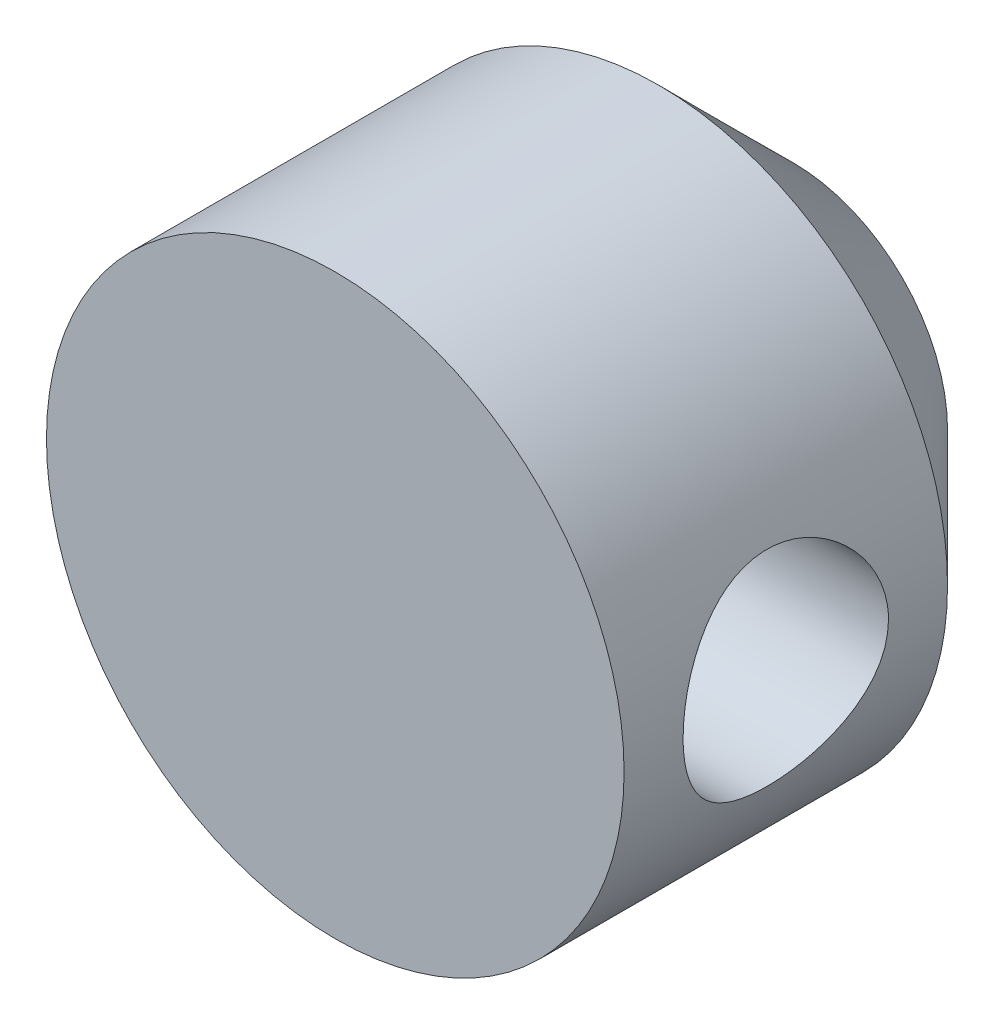
ISO-10303-21;
HEADER;
FILE_DESCRIPTION(('STEP AP214'),'2;1');
FILE_NAME('part.step','',(''),(''),'','','');
FILE_SCHEMA(('AUTOMOTIVE_DESIGN { 1 0 10303 214 1 1 1 1 }'));
ENDSEC;
DATA;
#1=APPLICATION_CONTEXT('core data for automotive mechanical design processes');
#2=APPLICATION_PROTOCOL_DEFINITION('international standard','automotive_design',2000,#1);
#3=PRODUCT_CONTEXT('',#1,'mechanical');
#4=PRODUCT('Part','Part','',(#3));
#5=PRODUCT_RELATED_PRODUCT_CATEGORY('part','',(#4));
#6=PRODUCT_DEFINITION_FORMATION('','',#4);
#7=PRODUCT_DEFINITION_CONTEXT('part definition',#1,'design');
#8=PRODUCT_DEFINITION('design','',#6,#7);
#9=PRODUCT_DEFINITION_SHAPE('','',#8);
#10=(LENGTH_UNIT() NAMED_UNIT(*) SI_UNIT(.MILLI.,.METRE.));
#11=(NAMED_UNIT(*) PLANE_ANGLE_UNIT() SI_UNIT($,.RADIAN.));
#12=(NAMED_UNIT(*) SI_UNIT($,.STERADIAN.) SOLID_ANGLE_UNIT());
#13=UNCERTAINTY_MEASURE_WITH_UNIT(LENGTH_MEASURE(1.E-05),#10,'distance_accuracy_value','');
#14=(GEOMETRIC_REPRESENTATION_CONTEXT(3) GLOBAL_UNCERTAINTY_ASSIGNED_CONTEXT((#13)) GLOBAL_UNIT_ASSIGNED_CONTEXT((#10,
#11,#12)) REPRESENTATION_CONTEXT('',''));
#15=CARTESIAN_POINT('',(0.,0.,0.));
#16=DIRECTION('',(0.,0.,1.));
#17=DIRECTION('',(1.,0.,0.));
#18=AXIS2_PLACEMENT_3D('',#15,#16,#17);
#19=CARTESIAN_POINT('',(-2.22044604925031E-13,0.,0.));
#20=DIRECTION('',(0.,0.,1.));
#21=DIRECTION('',(1.,0.,0.));
#22=AXIS2_PLACEMENT_3D('',#19,#20,#21);
#23=CONICAL_SURFACE('',#22,28.575,0.78539816339745);
#24=CARTESIAN_POINT('',(-6.66133814775094E-13,0.,25.0000000000008));
#25=DIRECTION('',(0.,0.,1.));
#26=DIRECTION('',(1.,0.,0.));
#27=AXIS2_PLACEMENT_3D('',#24,#25,#26);
#28=CIRCLE('',#27,53.5750000000001);
#29=CARTESIAN_POINT('',(53.5749999999994,0.,25.0000000000008));
#30=VERTEX_POINT('',#29);
#31=EDGE_CURVE('E48',#30,#30,#28,.T.);
#32=ORIENTED_EDGE('',*,*,#31,.F.);
#33=EDGE_LOOP('',(#32));
#34=FACE_BOUND('',#33,.T.);
#35=CARTESIAN_POINT('',(-2.22044604925031E-13,0.,0.));
#36=DIRECTION('',(0.,0.,1.));
#37=DIRECTION('',(1.,0.,0.));
#38=AXIS2_PLACEMENT_3D('',#35,#36,#37);
#39=CIRCLE('',#38,28.575);
#40=CARTESIAN_POINT('',(28.5749999999998,0.,0.));
#41=VERTEX_POINT('',#40);
#42=EDGE_CURVE('E52',#41,#41,#39,.T.);
#43=ORIENTED_EDGE('',*,*,#42,.T.);
#44=EDGE_LOOP('',(#43));
#45=FACE_BOUND('',#44,.T.);
#46=ADVANCED_FACE('F34',(#34,#45),#23,.T.);
#47=CARTESIAN_POINT('',(-2.22044604925031E-13,0.,0.));
#48=DIRECTION('',(0.,0.,1.));
#49=DIRECTION('',(1.,0.,0.));
#50=AXIS2_PLACEMENT_3D('',#47,#48,#49);
#51=PLANE('',#50);
#52=ORIENTED_EDGE('',*,*,#42,.F.);
#53=EDGE_LOOP('',(#52));
#54=FACE_BOUND('',#53,.T.);
#55=ADVANCED_FACE('F71',(#54),#51,.F.);
#56=CARTESIAN_POINT('',(-6.66133814775094E-13,-6.66133814775094E-13,85.0000000000009));
#57=DIRECTION('',(0.,0.,-1.));
#58=DIRECTION('',(-1.,0.,0.));
#59=AXIS2_PLACEMENT_3D('',#56,#57,#58);
#60=CYLINDRICAL_SURFACE('',#59,53.5750000000001);
#61=CARTESIAN_POINT('',(-53.5750000000007,0.,35.9500000000001));
#62=CARTESIAN_POINT('',(-53.5750009042957,0.517683286684535,35.9499987245617));
#63=CARTESIAN_POINT('',(-53.5674799680966,1.0353479734931,35.9711185306932));
#64=CARTESIAN_POINT('',(-53.537604948691,2.06679402374458,36.055381301015));
#65=CARTESIAN_POINT('',(-53.5152515736517,2.5805755714016,36.1185222589272));
#66=CARTESIAN_POINT('',(-53.4563200288301,3.60047360863516,36.2862036891231));
#67=CARTESIAN_POINT('',(-53.4197424809623,4.10659043232655,36.390742351405));
#68=CARTESIAN_POINT('',(-53.333342459477,5.10760273371078,36.6402348822385));
#69=CARTESIAN_POINT('',(-53.2835197601504,5.60249802002261,36.7851894395153));
#70=CARTESIAN_POINT('',(-53.1720448167393,6.57679881218548,37.1139140406836));
#71=CARTESIAN_POINT('',(-53.1104147278737,7.05623139405239,37.2976114521261));
#72=CARTESIAN_POINT('',(-52.9768491830529,7.99750355425714,37.7024590607166));
#73=CARTESIAN_POINT('',(-52.904913782489,8.45934322714033,37.9236090565573));
#74=CARTESIAN_POINT('',(-52.7525341629502,9.36272718575201,38.4017149060764));
#75=CARTESIAN_POINT('',(-52.672088408913,9.80426778934299,38.6586772220951));
#76=CARTESIAN_POINT('',(-52.50468913618,10.6644391857606,39.2065746885147));
#77=CARTESIAN_POINT('',(-52.4177354343655,11.0830693333654,39.4975107949892));
#78=CARTESIAN_POINT('',(-52.2363314122028,11.9092990576828,40.1222108672873));
#79=CARTESIAN_POINT('',(-52.1417252950923,12.3160016414434,40.4571163527665));
#80=CARTESIAN_POINT('',(-51.9502954189071,13.1000114935635,41.1591510469942));
#81=CARTESIAN_POINT('',(-51.8534716140418,13.4773181542483,41.5262809215542));
#82=CARTESIAN_POINT('',(-51.6601320045238,14.2004051253775,42.2906399227101));
#83=CARTESIAN_POINT('',(-51.5636162854273,14.5461773081958,42.6878767609737));
#84=CARTESIAN_POINT('',(-51.37350909741,15.2039608081279,43.5100375728573));
#85=CARTESIAN_POINT('',(-51.2799176169988,15.5159722579126,43.934961437664));
#86=CARTESIAN_POINT('',(-51.0951863348062,16.1140878150535,44.8247557936476));
#87=CARTESIAN_POINT('',(-51.0042346538654,16.3989687400299,45.2904888780667));
#88=CARTESIAN_POINT('',(-50.8310010428056,16.9283064352598,46.2459597465815));
#89=CARTESIAN_POINT('',(-50.7487193557879,17.1727620721232,46.7356982032086));
#90=CARTESIAN_POINT('',(-50.5954859865528,17.619112604437,47.7357649525373));
#91=CARTESIAN_POINT('',(-50.5245311759774,17.8210192563954,48.2460875111908));
#92=CARTESIAN_POINT('',(-50.3963102292922,18.1804566864659,49.2837990193872));
#93=CARTESIAN_POINT('',(-50.3390433810658,18.33798977319,49.8111870794755));
#94=CARTESIAN_POINT('',(-50.2420618824237,18.6020128280836,50.8589342840411));
#95=CARTESIAN_POINT('',(-50.2017684073201,18.7101987816225,51.378812549969));
#96=CARTESIAN_POINT('',(-50.1370746734433,18.882873309271,52.4267600535403));
#97=CARTESIAN_POINT('',(-50.1126740435773,18.9473629036775,52.9548290996368));
#98=CARTESIAN_POINT('',(-50.0806157470271,19.0319364701942,54.0148542346612));
#99=CARTESIAN_POINT('',(-50.072952863072,19.052034279552,54.5468090604755));
#100=CARTESIAN_POINT('',(-50.0746244700264,19.0476409730848,55.6104984257232));
#101=CARTESIAN_POINT('',(-50.0839583913898,19.0231513513401,56.1422329719408));
#102=CARTESIAN_POINT('',(-50.1183536748408,18.9323379780826,57.1731281171759));
#103=CARTESIAN_POINT('',(-50.1425549136263,18.8683011569153,57.6725209947976));
#104=CARTESIAN_POINT('',(-50.2051472007502,18.7011169963627,58.6637886271437));
#105=CARTESIAN_POINT('',(-50.2435376727001,18.5979712456382,59.1556636864084));
#106=CARTESIAN_POINT('',(-50.3333531690773,18.3535040780302,60.1286495035839));
#107=CARTESIAN_POINT('',(-50.3847794216127,18.2121790641743,60.6097592426377));
#108=CARTESIAN_POINT('',(-50.4991634196981,17.8925654550268,61.5581256682425));
#109=CARTESIAN_POINT('',(-50.5621215083783,17.7142757598292,62.0253819421024));
#110=CARTESIAN_POINT('',(-50.6989976430138,17.3186838728386,62.9513272014527));
#111=CARTESIAN_POINT('',(-50.7730891271025,17.1007501204542,63.4097205372311));
#112=CARTESIAN_POINT('',(-50.9293219492453,16.6296824480774,64.3065973290737));
#113=CARTESIAN_POINT('',(-51.0114633271021,16.3765483540344,64.7450806866774));
#114=CARTESIAN_POINT('',(-51.1816276780509,15.836719888503,65.5998289752987));
#115=CARTESIAN_POINT('',(-51.2696521789896,15.5500167844959,66.0160880837961));
#116=CARTESIAN_POINT('',(-51.4493045125963,14.9448751846309,66.8240424717227));
#117=CARTESIAN_POINT('',(-51.5409324909665,14.6264354047391,67.2157367562384));
#118=CARTESIAN_POINT('',(-51.7310486013983,13.9396432059813,67.9951748808241));
#119=CARTESIAN_POINT('',(-51.8296185348351,13.5694425616828,68.3812722464586));
#120=CARTESIAN_POINT('',(-52.0255462679493,12.7977196630611,69.12114139699));
#121=CARTESIAN_POINT('',(-52.122904020069,12.3961961843097,69.4749119170362));
#122=CARTESIAN_POINT('',(-52.3137860486001,11.5641933679632,70.1478788446041));
#123=CARTESIAN_POINT('',(-52.4073098105853,11.1337101650238,70.4670706218928));
#124=CARTESIAN_POINT('',(-52.587981568426,10.2464509250506,71.0686030154755));
#125=CARTESIAN_POINT('',(-52.6751296079017,9.78967506793845,71.3509438838985));
#126=CARTESIAN_POINT('',(-52.8417286684245,8.84671822187346,71.8799888636882));
#127=CARTESIAN_POINT('',(-52.921067691352,8.36023712025865,72.1261940293476));
#128=CARTESIAN_POINT('',(-53.068516205567,7.36651096565864,72.5765348927666));
#129=CARTESIAN_POINT('',(-53.1366255219585,6.85926558943555,72.7806699353209));
#130=CARTESIAN_POINT('',(-53.2596167386403,5.82781970539629,73.1449179763384));
#131=CARTESIAN_POINT('',(-53.3145028974742,5.30362471808572,73.3050451499658));
#132=CARTESIAN_POINT('',(-53.4094455974232,4.24212395174735,73.5797577143168));
#133=CARTESIAN_POINT('',(-53.4495029264223,3.70481887090119,73.6943455246576));
#134=CARTESIAN_POINT('',(-53.5120254928523,2.64771035443423,73.8723429271238));
#135=CARTESIAN_POINT('',(-53.5352504854556,2.12832389537014,73.937967355563));
#136=CARTESIAN_POINT('',(-53.5665426002022,1.08546169798756,74.0262471386376));
#137=CARTESIAN_POINT('',(-53.5746102134453,0.561986092709421,74.0489038854279));
#138=CARTESIAN_POINT('',(-53.5753621078564,-0.484969548404686,74.0510182727164));
#139=CARTESIAN_POINT('',(-53.5680490524678,-1.00844956777848,74.0304833926325));
#140=CARTESIAN_POINT('',(-53.5382494052639,-2.0515064260186,73.9464394594926));
#141=CARTESIAN_POINT('',(-53.5157630050344,-2.5710833140839,73.8829309490413));
#142=CARTESIAN_POINT('',(-53.4572525956026,-3.58494910532398,73.7164517065943));
#143=CARTESIAN_POINT('',(-53.4217129462269,-4.07949843624773,73.6148905466835));
#144=CARTESIAN_POINT('',(-53.3379678520519,-5.05795503011836,73.3731743411988));
#145=CARTESIAN_POINT('',(-53.2897627694143,-5.54186259693233,73.2330203991604));
#146=CARTESIAN_POINT('',(-53.1818931603168,-6.49595214268832,72.9152992894683));
#147=CARTESIAN_POINT('',(-53.122227660261,-6.96613295159006,72.7377289430576));
#148=CARTESIAN_POINT('',(-52.9929089947445,-7.88985145512553,72.3465941558526));
#149=CARTESIAN_POINT('',(-52.9232555232998,-8.34338863934304,72.1330286123016));
#150=CARTESIAN_POINT('',(-52.7735700224386,-9.24364435602619,71.6649959991927));
#151=CARTESIAN_POINT('',(-52.6933015334285,-9.68981405995557,71.4095490295748));
#152=CARTESIAN_POINT('',(-52.5260000832169,-10.5591628847586,70.8641079168116));
#153=CARTESIAN_POINT('',(-52.4389670298326,-10.9823416921951,70.5741133028467));
#154=CARTESIAN_POINT('',(-52.2602689802372,-11.8034538603555,69.9613991550422));
#155=CARTESIAN_POINT('',(-52.1686026459479,-12.2013798524367,69.6386701401996));
#156=CARTESIAN_POINT('',(-51.9829262090086,-12.9696657593257,68.9625267370625));
#157=CARTESIAN_POINT('',(-51.8889160326753,-13.3400248060505,68.609111383214));
#158=CARTESIAN_POINT('',(-51.6959920055591,-14.069639448986,67.8544676031126));
#159=CARTESIAN_POINT('',(-51.5970776881153,-14.4273129501072,67.4517078065438));
#160=CARTESIAN_POINT('',(-51.4020102048315,-15.1075883232304,66.6169358356553));
#161=CARTESIAN_POINT('',(-51.3058571412624,-15.4301888974361,66.1849225798351));
#162=CARTESIAN_POINT('',(-51.1190761289569,-16.0381371558674,65.2942407046809));
#163=CARTESIAN_POINT('',(-51.0284485864972,-16.3234821025435,64.8355701301374));
#164=CARTESIAN_POINT('',(-50.855438086889,-16.8547658368213,63.8944555952746));
#165=CARTESIAN_POINT('',(-50.773054992354,-17.1007052811229,63.4120120313117));
#166=CARTESIAN_POINT('',(-50.6190365376997,-17.5513693362448,62.4260347205875));
#167=CARTESIAN_POINT('',(-50.5474108982023,-17.7560567274103,61.9224824188337));
#168=CARTESIAN_POINT('',(-50.4173448351656,-18.1220786716304,60.8981806017724));
#169=CARTESIAN_POINT('',(-50.358904490694,-18.2834129647119,60.3774309833599));
#170=CARTESIAN_POINT('',(-50.2572365792569,-18.5610527820157,59.3228444719039));
#171=CARTESIAN_POINT('',(-50.2140021977121,-18.6773784792663,58.7890135562966));
#172=CARTESIAN_POINT('',(-50.144252316857,-18.8638422098205,57.7122747144352));
#173=CARTESIAN_POINT('',(-50.1177358121698,-18.9339830205944,57.169367336036));
#174=CARTESIAN_POINT('',(-50.0834145686287,-19.024573006956,56.110729379965));
#175=CARTESIAN_POINT('',(-50.0746103310436,-19.0476774272699,55.5952567427427));
#176=CARTESIAN_POINT('',(-50.0729702771832,-19.0519892160963,54.5641222599813));
#177=CARTESIAN_POINT('',(-50.0801338123746,-19.0331982861942,54.0484604229771));
#178=CARTESIAN_POINT('',(-50.1101918777172,-18.9539197686993,53.0208635658067));
#179=CARTESIAN_POINT('',(-50.1330852059748,-18.8934353668507,52.5089282639208));
#180=CARTESIAN_POINT('',(-50.1938564607551,-18.7313872350656,51.4925115609706));
#181=CARTESIAN_POINT('',(-50.2317344092067,-18.6298234450124,50.9880301708157));
#182=CARTESIAN_POINT('',(-50.3201625536368,-18.3896110412238,50.0024398707026));
#183=CARTESIAN_POINT('',(-50.3703763680109,-18.2519411619074,49.5210614682616));
#184=CARTESIAN_POINT('',(-50.4824419374438,-17.9396537166585,48.5718624781645));
#185=CARTESIAN_POINT('',(-50.5442934229803,-17.7650370063832,48.1040415768135));
#186=CARTESIAN_POINT('',(-50.6779101319756,-17.3802045985648,47.1846704938337));
#187=CARTESIAN_POINT('',(-50.7496769733954,-17.1699830898601,46.7331229828455));
#188=CARTESIAN_POINT('',(-50.901189931732,-16.7154674377815,45.8488908378291));
#189=CARTESIAN_POINT('',(-50.9809366401993,-16.4711707678737,45.4162076056353));
#190=CARTESIAN_POINT('',(-51.1503537231531,-15.9375040148214,44.5516089392938));
#191=CARTESIAN_POINT('',(-51.2403175595086,-15.6465249701592,44.1207436319523));
#192=CARTESIAN_POINT('',(-51.4242985190679,-15.030813660155,43.2847682224348));
#193=CARTESIAN_POINT('',(-51.5183157499098,-14.7060804981469,42.8796588049159));
#194=CARTESIAN_POINT('',(-51.7079476746974,-14.0247572792416,42.0973725337317));
#195=CARTESIAN_POINT('',(-51.8035628118214,-13.6681582610291,41.7202035923728));
#196=CARTESIAN_POINT('',(-51.9938949052896,-12.9252670820375,40.9961066182562));
#197=CARTESIAN_POINT('',(-52.0886118691693,-12.5389751706236,40.6491783315854));
#198=CARTESIAN_POINT('',(-52.2790877139507,-11.7201704655263,39.9721825107996));
#199=CARTESIAN_POINT('',(-52.3746885095418,-11.2863413889507,39.6436600942644));
#200=CARTESIAN_POINT('',(-52.5596013334585,-10.3912349318706,39.0243644676105));
#201=CARTESIAN_POINT('',(-52.6489131677305,-9.92995670519866,38.7335924220923));
#202=CARTESIAN_POINT('',(-52.8187346621002,-8.98294263142959,38.1920634619826));
#203=CARTESIAN_POINT('',(-52.8992447013388,-8.49720783912682,37.9413048235827));
#204=CARTESIAN_POINT('',(-53.0491680641232,-7.50455245410537,37.481915865459));
#205=CARTESIAN_POINT('',(-53.1185815812518,-6.99763223116918,37.2732848107868));
#206=CARTESIAN_POINT('',(-53.2443503376335,-5.96574748923959,36.8998986064845));
#207=CARTESIAN_POINT('',(-53.3006933190483,-5.44076655798228,36.7351846218145));
#208=CARTESIAN_POINT('',(-53.3985566084108,-4.37720496968063,36.4515374056689));
#209=CARTESIAN_POINT('',(-53.4400767849656,-3.83862419212922,36.3326045800079));
#210=CARTESIAN_POINT('',(-53.5070190366077,-2.75236933340123,36.1418200825683));
#211=CARTESIAN_POINT('',(-53.5324462565494,-2.20469821588983,36.0699533636861));
#212=CARTESIAN_POINT('',(-53.5664357749997,-1.10467749563222,35.9740453663618));
#213=CARTESIAN_POINT('',(-53.5749990351876,-0.552328161468784,35.9500013607946));
#214=CARTESIAN_POINT('',(-53.5750000000007,0.,35.9500000000001));
#215=B_SPLINE_CURVE_WITH_KNOTS('',3,(#61,#62,#63,#64,#65,#66,#67,#68,#69,#70,#71,#72,#73,#74,
#75,#76,#77,#78,#79,#80,#81,#82,#83,#84,#85,#86,#87,#88,#89,#90,#91,#92,#93,#94,#95,#96,#97,#98,
#99,#100,#101,#102,#103,#104,#105,#106,#107,#108,#109,#110,#111,#112,#113,#114,#115,#116,#117,
#118,#119,#120,#121,#122,#123,#124,#125,#126,#127,#128,#129,#130,#131,#132,#133,#134,#135,#136,
#137,#138,#139,#140,#141,#142,#143,#144,#145,#146,#147,#148,#149,#150,#151,#152,#153,#154,#155,
#156,#157,#158,#159,#160,#161,#162,#163,#164,#165,#166,#167,#168,#169,#170,#171,#172,#173,#174,
#175,#176,#177,#178,#179,#180,#181,#182,#183,#184,#185,#186,#187,#188,#189,#190,#191,#192,#193,
#194,#195,#196,#197,#198,#199,#200,#201,#202,#203,#204,#205,#206,#207,#208,#209,#210,#211,#212,
#213,#214),.UNSPECIFIED.,.T.,.F.,(4,2,2,2,2,2,2,2,2,2,2,2,2,2,2,2,2,2,2,2,2,2,2,2,2,2,2,2,2,2,2,
2,2,2,2,2,2,2,2,2,2,2,2,2,2,2,2,2,2,2,2,2,2,2,2,2,2,2,2,2,2,2,2,2,2,2,2,2,2,2,2,2,2,2,2,2,4),
(0.,1.55253485283242,3.10499558601399,4.65738844957311,6.20980776899142,7.75934218570708,
9.30886827395652,10.8586743374016,12.4085240252386,14.0125454494143,15.6166000232445,
17.2210668610099,18.8255273934075,20.4839131068117,22.1423453079349,23.8003186729781,
25.458205763133,27.0537783726365,28.6493137247151,30.2443516664024,31.8393361609456,
33.3497530874679,34.8601086652634,36.3706065874282,37.8811494618074,39.4182856275224,
40.9554293939878,42.4929739195154,44.030580677821,45.6604241750016,47.2903314156941,
48.9204566384633,50.5505707075423,52.2014184516181,53.8522919042541,55.5026329770465,
57.1528863514768,58.7230104875461,60.2930837506536,61.8628851493279,63.4326667273392,
64.9492750992846,66.4658401093105,67.9825340129834,69.4992743908666,71.0585932298595,
72.6179333218718,74.1777263488496,75.7375684729385,77.3786249669585,79.0197421640015,
80.6609798828166,82.3021902472608,83.94487482866,85.5875692604324,87.2295265749041,
88.8713851361948,90.4176568745682,91.9638658120428,93.5099566187829,95.0560496881179,
96.5639257551256,98.0717669048248,99.579854391196,101.088053755592,102.669228005001,
104.250444268487,105.832106609438,107.413755668811,109.069303306844,110.724902006462,
112.380429362346,114.035927833779,115.692972647903,117.350032150115,119.006561629021,
120.662996640421),.UNSPECIFIED.);
#216=CARTESIAN_POINT('',(-53.5750000000007,0.,35.9500000000001));
#217=VERTEX_POINT('',#216);
#218=EDGE_CURVE('E10',#217,#217,#215,.T.);
#219=ORIENTED_EDGE('',*,*,#218,.T.);
#220=EDGE_LOOP('',(#219));
#221=FACE_BOUND('',#220,.T.);
#222=CARTESIAN_POINT('',(53.5749999999994,0.,35.9500000000008));
#223=CARTESIAN_POINT('',(53.5750009042944,-0.517683286684576,35.9499987245624));
#224=CARTESIAN_POINT('',(53.5674799680953,-1.03534797349318,35.9711185306934));
#225=CARTESIAN_POINT('',(53.5376049486897,-2.06679402374471,36.0553813010148));
#226=CARTESIAN_POINT('',(53.5152515736505,-2.58057557140173,36.1185222589272));
#227=CARTESIAN_POINT('',(53.4563200288289,-3.60047360863533,36.2862036891232));
#228=CARTESIAN_POINT('',(53.4197424809611,-4.10659043232674,36.390742351405));
#229=CARTESIAN_POINT('',(53.3333424594758,-5.10760273371099,36.6402348822386));
#230=CARTESIAN_POINT('',(53.2835197601491,-5.6024980200228,36.7851894395155));
#231=CARTESIAN_POINT('',(53.172044816738,-6.57679881218574,37.1139140406838));
#232=CARTESIAN_POINT('',(53.1104147278725,-7.0562313940527,37.2976114521263));
#233=CARTESIAN_POINT('',(52.9768491830518,-7.99750355425757,37.7024590607167));
#234=CARTESIAN_POINT('',(52.9049137824878,-8.45934322714081,37.9236090565574));
#235=CARTESIAN_POINT('',(52.7525341629491,-9.36272718575243,38.4017149060768));
#236=CARTESIAN_POINT('',(52.6720884089119,-9.80426778934329,38.6586772220956));
#237=CARTESIAN_POINT('',(52.5046891361788,-10.6644391857613,39.2065746885147));
#238=CARTESIAN_POINT('',(52.4177354343641,-11.0830693333665,39.4975107949886));
#239=CARTESIAN_POINT('',(52.2363314122015,-11.9092990576838,40.1222108672866));
#240=CARTESIAN_POINT('',(52.1417252950912,-12.3160016414438,40.4571163527664));
#241=CARTESIAN_POINT('',(51.9502954189062,-13.1000114935634,41.1591510469946));
#242=CARTESIAN_POINT('',(51.8534716140407,-13.4773181542484,41.5262809215544));
#243=CARTESIAN_POINT('',(51.6601320045228,-14.2004051253776,42.2906399227101));
#244=CARTESIAN_POINT('',(51.5636162854264,-14.5461773081959,42.6878767609737));
#245=CARTESIAN_POINT('',(51.3735090974089,-15.2039608081278,43.5100375728574));
#246=CARTESIAN_POINT('',(51.2799176169975,-15.5159722579124,43.934961437664));
#247=CARTESIAN_POINT('',(51.0951863348048,-16.1140878150533,44.8247557936476));
#248=CARTESIAN_POINT('',(51.0042346538643,-16.3989687400298,45.2904888780667));
#249=CARTESIAN_POINT('',(50.8310010428048,-16.9283064352598,46.2459597465814));
#250=CARTESIAN_POINT('',(50.748719355787,-17.1727620721231,46.7356982032086));
#251=CARTESIAN_POINT('',(50.5954859865519,-17.619112604437,47.7357649525372));
#252=CARTESIAN_POINT('',(50.5245311759767,-17.8210192563955,48.2460875111907));
#253=CARTESIAN_POINT('',(50.3963102292913,-18.1804566864658,49.2837990193871));
#254=CARTESIAN_POINT('',(50.3390433810645,-18.3379897731896,49.8111870794756));
#255=CARTESIAN_POINT('',(50.2420618824224,-18.6020128280832,50.8589342840412));
#256=CARTESIAN_POINT('',(50.2017684073192,-18.7101987816224,51.3788125499691));
#257=CARTESIAN_POINT('',(50.1370746734425,-18.8828733092712,52.4267600535405));
#258=CARTESIAN_POINT('',(50.1126740435764,-18.9473629036775,52.9548290996371));
#259=CARTESIAN_POINT('',(50.0806157470263,-19.0319364701942,54.0148542346617));
#260=CARTESIAN_POINT('',(50.0729528630714,-19.0520342795521,54.546809060476));
#261=CARTESIAN_POINT('',(50.0746244700254,-19.0476409730848,55.6104984257238));
#262=CARTESIAN_POINT('',(50.0839583913885,-19.0231513513399,56.1422329719414));
#263=CARTESIAN_POINT('',(50.1183536748395,-18.9323379780823,57.1731281171765));
#264=CARTESIAN_POINT('',(50.1425549136253,-18.8683011569151,57.6725209947981));
#265=CARTESIAN_POINT('',(50.2051472007495,-18.7011169963627,58.663788627144));
#266=CARTESIAN_POINT('',(50.2435376726993,-18.5979712456382,59.1556636864087));
#267=CARTESIAN_POINT('',(50.3333531690764,-18.3535040780302,60.1286495035841));
#268=CARTESIAN_POINT('',(50.384779421612,-18.2121790641743,60.6097592426379));
#269=CARTESIAN_POINT('',(50.4991634196972,-17.8925654550268,61.5581256682426));
#270=CARTESIAN_POINT('',(50.562121508377,-17.7142757598292,62.0253819421025));
#271=CARTESIAN_POINT('',(50.6989976430125,-17.3186838728386,62.9513272014527));
#272=CARTESIAN_POINT('',(50.7730891271015,-17.1007501204543,63.4097205372309));
#273=CARTESIAN_POINT('',(50.9293219492445,-16.6296824480776,64.3065973290735));
#274=CARTESIAN_POINT('',(51.0114633271012,-16.3765483540346,64.7450806866773));
#275=CARTESIAN_POINT('',(51.1816276780499,-15.8367198885031,65.5998289752984));
#276=CARTESIAN_POINT('',(51.2696521789886,-15.5500167844958,66.0160880837955));
#277=CARTESIAN_POINT('',(51.4493045125953,-14.9448751846316,66.8240424717225));
#278=CARTESIAN_POINT('',(51.5409324909654,-14.6264354047407,67.2157367562389));
#279=CARTESIAN_POINT('',(51.731048601397,-13.9396432059832,67.9951748808245));
#280=CARTESIAN_POINT('',(51.8296185348339,-13.5694425616838,68.3812722464582));
#281=CARTESIAN_POINT('',(52.0255462679481,-12.7977196630616,69.121141396989));
#282=CARTESIAN_POINT('',(52.1229040200677,-12.3961961843104,69.4749119170354));
#283=CARTESIAN_POINT('',(52.3137860485989,-11.5641933679642,70.1478788446035));
#284=CARTESIAN_POINT('',(52.407309810584,-11.1337101650248,70.4670706218923));
#285=CARTESIAN_POINT('',(52.5879815684248,-10.2464509250514,71.0686030154748));
#286=CARTESIAN_POINT('',(52.6751296079004,-9.78967506793912,71.3509438838976));
#287=CARTESIAN_POINT('',(52.8417286684231,-8.84671822187414,71.8799888636873));
#288=CARTESIAN_POINT('',(52.9210676913507,-8.36023712025951,72.1261940293471));
#289=CARTESIAN_POINT('',(53.0685162055658,-7.36651096565964,72.5765348927663));
#290=CARTESIAN_POINT('',(53.1366255219572,-6.85926558943652,72.7806699353206));
#291=CARTESIAN_POINT('',(53.259616738639,-5.82781970539728,73.144917976338));
#292=CARTESIAN_POINT('',(53.3145028974729,-5.30362471808676,73.3050451499654));
#293=CARTESIAN_POINT('',(53.4094455974219,-4.24212395174853,73.5797577143166));
#294=CARTESIAN_POINT('',(53.449502926421,-3.70481887090246,73.6943455246575));
#295=CARTESIAN_POINT('',(53.512025492851,-2.64771035443552,73.8723429271239));
#296=CARTESIAN_POINT('',(53.5352504854543,-2.12832389537136,73.9379673555629));
#297=CARTESIAN_POINT('',(53.5665426002009,-1.08546169798865,74.0262471386375));
#298=CARTESIAN_POINT('',(53.5746102134439,-0.561986092710451,74.0489038854279));
#299=CARTESIAN_POINT('',(53.5753621078551,0.484969548403794,74.0510182727164));
#300=CARTESIAN_POINT('',(53.5680490524664,1.00844956777767,74.0304833926325));
#301=CARTESIAN_POINT('',(53.5382494052626,2.05150642601798,73.9464394594927));
#302=CARTESIAN_POINT('',(53.5157630050331,2.57108331408339,73.8829309490417));
#303=CARTESIAN_POINT('',(53.4572525956013,3.58494910532358,73.7164517065947));
#304=CARTESIAN_POINT('',(53.4217129462255,4.07949843624732,73.6148905466836));
#305=CARTESIAN_POINT('',(53.3379678520505,5.05795503011803,73.3731743411988));
#306=CARTESIAN_POINT('',(53.2897627694129,5.54186259693208,73.2330203991604));
#307=CARTESIAN_POINT('',(53.1818931603153,6.49595214268817,72.9152992894683));
#308=CARTESIAN_POINT('',(53.1222276602595,6.96613295158993,72.7377289430575));
#309=CARTESIAN_POINT('',(52.992908994743,7.88985145512556,72.3465941558526));
#310=CARTESIAN_POINT('',(52.9232555232985,8.34338863934323,72.1330286123019));
#311=CARTESIAN_POINT('',(52.7735700224373,9.24364435602639,71.664995999193));
#312=CARTESIAN_POINT('',(52.693301533427,9.68981405995561,71.4095490295749));
#313=CARTESIAN_POINT('',(52.5260000832152,10.5591628847585,70.8641079168116));
#314=CARTESIAN_POINT('',(52.438967029831,10.982341692195,70.5741133028467));
#315=CARTESIAN_POINT('',(52.2602689802356,11.8034538603554,69.9613991550423));
#316=CARTESIAN_POINT('',(52.1686026459463,12.2013798524366,69.6386701401997));
#317=CARTESIAN_POINT('',(51.9829262090071,12.9696657593255,68.9625267370626));
#318=CARTESIAN_POINT('',(51.8889160326739,13.3400248060503,68.609111383214));
#319=CARTESIAN_POINT('',(51.6959920055578,14.0696394489858,67.8544676031126));
#320=CARTESIAN_POINT('',(51.5970776881137,14.4273129501069,67.451707806544));
#321=CARTESIAN_POINT('',(51.4020102048298,15.1075883232301,66.6169358356557));
#322=CARTESIAN_POINT('',(51.3058571412608,15.4301888974358,66.1849225798356));
#323=CARTESIAN_POINT('',(51.1190761289553,16.038137155867,65.2942407046815));
#324=CARTESIAN_POINT('',(51.0284485864955,16.3234821025431,64.8355701301381));
#325=CARTESIAN_POINT('',(50.8554380868875,16.8547658368208,63.8944555952754));
#326=CARTESIAN_POINT('',(50.7730549923526,17.1007052811222,63.4120120313125));
#327=CARTESIAN_POINT('',(50.6190365376984,17.5513693362441,62.4260347205884));
#328=CARTESIAN_POINT('',(50.5474108982008,17.7560567274099,61.9224824188346));
#329=CARTESIAN_POINT('',(50.4173448351638,18.1220786716301,60.8981806017735));
#330=CARTESIAN_POINT('',(50.3589044906923,18.2834129647116,60.3774309833609));
#331=CARTESIAN_POINT('',(50.2572365792552,18.5610527820155,59.3228444719049));
#332=CARTESIAN_POINT('',(50.2140021977102,18.6773784792663,58.7890135562976));
#333=CARTESIAN_POINT('',(50.1442523168554,18.8638422098202,57.7122747144362));
#334=CARTESIAN_POINT('',(50.1177358121686,18.9339830205937,57.1693673360369));
#335=CARTESIAN_POINT('',(50.0834145686275,19.0245730069554,56.1107293799658));
#336=CARTESIAN_POINT('',(50.0746103310419,19.0476774272698,55.5952567427434));
#337=CARTESIAN_POINT('',(50.0729702771812,19.0519892160964,54.5641222599819));
#338=CARTESIAN_POINT('',(50.0801338123727,19.0331982861942,54.0484604229776));
#339=CARTESIAN_POINT('',(50.1101918777153,18.9539197686993,53.020863565807));
#340=CARTESIAN_POINT('',(50.1330852059728,18.893435366851,52.508928263921));
#341=CARTESIAN_POINT('',(50.1938564607534,18.7313872350654,51.4925115609707));
#342=CARTESIAN_POINT('',(50.2317344092053,18.6298234450115,50.9880301708159));
#343=CARTESIAN_POINT('',(50.3201625536355,18.3896110412229,50.0024398707025));
#344=CARTESIAN_POINT('',(50.3703763680093,18.2519411619071,49.5210614682611));
#345=CARTESIAN_POINT('',(50.482441937442,17.9396537166585,48.5718624781637));
#346=CARTESIAN_POINT('',(50.5442934229786,17.765037006383,48.1040415768127));
#347=CARTESIAN_POINT('',(50.677910131974,17.3802045985643,47.1846704938327));
#348=CARTESIAN_POINT('',(50.7496769733937,17.1699830898594,46.7331229828446));
#349=CARTESIAN_POINT('',(50.9011899317305,16.7154674377811,45.8488908378278));
#350=CARTESIAN_POINT('',(50.980936640198,16.4711707678738,45.4162076056338));
#351=CARTESIAN_POINT('',(51.1503537231518,15.9375040148215,44.5516089392923));
#352=CARTESIAN_POINT('',(51.2403175595071,15.6465249701587,44.1207436319512));
#353=CARTESIAN_POINT('',(51.4242985190663,15.0308136601542,43.2847682224341));
#354=CARTESIAN_POINT('',(51.5183157499083,14.7060804981462,42.8796588049152));
#355=CARTESIAN_POINT('',(51.7079476746959,14.0247572792411,42.097372533731));
#356=CARTESIAN_POINT('',(51.8035628118198,13.6681582610286,41.7202035923721));
#357=CARTESIAN_POINT('',(51.9938949052881,12.9252670820368,40.9961066182559));
#358=CARTESIAN_POINT('',(52.088611869168,12.5389751706227,40.6491783315854));
#359=CARTESIAN_POINT('',(52.2790877139494,11.7201704655254,39.9721825107996));
#360=CARTESIAN_POINT('',(52.3746885095403,11.28634138895,39.6436600942641));
#361=CARTESIAN_POINT('',(52.559601333457,10.39123493187,39.0243644676099));
#362=CARTESIAN_POINT('',(52.648913167729,9.92995670519796,38.7335924220919));
#363=CARTESIAN_POINT('',(52.8187346620987,8.98294263142887,38.1920634619822));
#364=CARTESIAN_POINT('',(52.8992447013374,8.49720783912615,37.9413048235823));
#365=CARTESIAN_POINT('',(53.0491680641218,7.50455245410463,37.4819158654588));
#366=CARTESIAN_POINT('',(53.1185815812505,6.99763223116831,37.273284810787));
#367=CARTESIAN_POINT('',(53.2443503376321,5.96574748923873,36.8998986064848));
#368=CARTESIAN_POINT('',(53.3006933190469,5.44076655798159,36.7351846218144));
#369=CARTESIAN_POINT('',(53.3985566084094,4.37720496968016,36.4515374056686));
#370=CARTESIAN_POINT('',(53.4400767849642,3.83862419212881,36.3326045800078));
#371=CARTESIAN_POINT('',(53.5070190366063,2.75236933340096,36.1418200825683));
#372=CARTESIAN_POINT('',(53.532446256548,2.20469821588964,36.0699533636859));
#373=CARTESIAN_POINT('',(53.5664357749984,1.10467749563216,35.9740453663619));
#374=CARTESIAN_POINT('',(53.5749990351863,0.552328161468751,35.9500013607953));
#375=CARTESIAN_POINT('',(53.5749999999994,0.,35.9500000000008));
#376=B_SPLINE_CURVE_WITH_KNOTS('',3,(#222,#223,#224,#225,#226,#227,#228,#229,#230,#231,#232,
#233,#234,#235,#236,#237,#238,#239,#240,#241,#242,#243,#244,#245,#246,#247,#248,#249,#250,#251,
#252,#253,#254,#255,#256,#257,#258,#259,#260,#261,#262,#263,#264,#265,#266,#267,#268,#269,#270,
#271,#272,#273,#274,#275,#276,#277,#278,#279,#280,#281,#282,#283,#284,#285,#286,#287,#288,#289,
#290,#291,#292,#293,#294,#295,#296,#297,#298,#299,#300,#301,#302,#303,#304,#305,#306,#307,#308,
#309,#310,#311,#312,#313,#314,#315,#316,#317,#318,#319,#320,#321,#322,#323,#324,#325,#326,#327,
#328,#329,#330,#331,#332,#333,#334,#335,#336,#337,#338,#339,#340,#341,#342,#343,#344,#345,#346,
#347,#348,#349,#350,#351,#352,#353,#354,#355,#356,#357,#358,#359,#360,#361,#362,#363,#364,#365,
#366,#367,#368,#369,#370,#371,#372,#373,#374,#375),.UNSPECIFIED.,.T.,.F.,(4,2,2,2,2,2,2,2,2,2,2,
2,2,2,2,2,2,2,2,2,2,2,2,2,2,2,2,2,2,2,2,2,2,2,2,2,2,2,2,2,2,2,2,2,2,2,2,2,2,2,2,2,2,2,2,2,2,2,2,
2,2,2,2,2,2,2,2,2,2,2,2,2,2,2,2,2,4),(0.,1.55253485283251,3.1049955860141,4.65738844957329,
6.20980776899167,7.75934218570743,9.30886827395699,10.8586743374021,12.4085240252391,
14.0125454494146,15.6166000232446,17.2210668610099,18.8255273934075,20.4839131068117,
22.1423453079349,23.800318672978,25.4582057631329,27.0537783726366,28.6493137247154,
30.2443516664028,31.8393361609462,33.3497530874683,34.8601086652636,36.3706065874282,
37.8811494618073,39.4182856275222,40.9554293939875,42.4929739195149,44.0305806778202,
45.6604241750006,47.290331415693,48.9204566384623,50.5505707075413,52.2014184516171,
53.8522919042531,55.5026329770454,57.1528863514755,58.7230104875449,60.2930837506526,
61.8628851493272,63.4326667273388,64.9492750992843,66.4658401093103,67.9825340129834,
69.4992743908667,71.0585932298596,72.6179333218718,74.1777263488496,75.7375684729384,
77.3786249669582,79.019742164001,80.6609798828158,82.3021902472598,83.9448748286591,
85.5875692604314,87.2295265749032,88.871385136194,90.4176568745676,91.9638658120425,
93.5099566187828,95.0560496881182,96.5639257551262,98.0717669048258,99.5798543911972,
101.088053755593,102.669228005002,104.250444268488,105.832106609439,107.413755668812,
109.069303306845,110.724902006463,112.380429362347,114.03592783378,115.692972647904,
117.350032150115,119.006561629021,120.662996640421),.UNSPECIFIED.);
#377=CARTESIAN_POINT('',(53.5749999999994,0.,35.9500000000008));
#378=VERTEX_POINT('',#377);
#379=EDGE_CURVE('E44',#378,#378,#376,.T.);
#380=ORIENTED_EDGE('',*,*,#379,.T.);
#381=EDGE_LOOP('',(#380));
#382=FACE_BOUND('',#381,.T.);
#383=CARTESIAN_POINT('',(-6.66133814775094E-13,-6.66133814775094E-13,85.0000000000009));
#384=DIRECTION('',(0.,0.,1.));
#385=DIRECTION('',(1.,0.,0.));
#386=AXIS2_PLACEMENT_3D('',#383,#384,#385);
#387=CIRCLE('',#386,53.5750000000001);
#388=CARTESIAN_POINT('',(53.5749999999994,-6.66133814775094E-13,85.0000000000009));
#389=VERTEX_POINT('',#388);
#390=EDGE_CURVE('E83',#389,#389,#387,.T.);
#391=ORIENTED_EDGE('',*,*,#390,.F.);
#392=EDGE_LOOP('',(#391));
#393=FACE_BOUND('',#392,.T.);
#394=ORIENTED_EDGE('',*,*,#31,.T.);
#395=EDGE_LOOP('',(#394));
#396=FACE_BOUND('',#395,.T.);
#397=ADVANCED_FACE('F57',(#221,#382,#393,#396),#60,.T.);
#398=CARTESIAN_POINT('',(-6.66133814775094E-13,-6.66133814775094E-13,85.0000000000009));
#399=DIRECTION('',(0.,0.,1.));
#400=DIRECTION('',(1.,0.,0.));
#401=AXIS2_PLACEMENT_3D('',#398,#399,#400);
#402=PLANE('',#401);
#403=ORIENTED_EDGE('',*,*,#390,.T.);
#404=EDGE_LOOP('',(#403));
#405=FACE_BOUND('',#404,.T.);
#406=ADVANCED_FACE('F63',(#405),#402,.T.);
#407=CARTESIAN_POINT('',(-53.5750000000007,0.,54.9999999999999));
#408=DIRECTION('',(1.,0.,0.));
#409=DIRECTION('',(0.,0.,-1.));
#410=AXIS2_PLACEMENT_3D('',#407,#408,#409);
#411=CYLINDRICAL_SURFACE('',#410,19.05);
#412=ORIENTED_EDGE('',*,*,#379,.F.);
#413=EDGE_LOOP('',(#412));
#414=FACE_BOUND('',#413,.T.);
#415=ORIENTED_EDGE('',*,*,#218,.F.);
#416=EDGE_LOOP('',(#415));
#417=FACE_BOUND('',#416,.T.);
#418=ADVANCED_FACE('F60',(#414,#417),#411,.F.);
#419=CLOSED_SHELL('',(#46,#55,#397,#406,#418));
#420=MANIFOLD_SOLID_BREP('B2',#419);
#421=ADVANCED_BREP_SHAPE_REPRESENTATION('',(#18,#420),#14);
#422=SHAPE_DEFINITION_REPRESENTATION(#9,#421);
ENDSEC;
END-ISO-10303-21;
